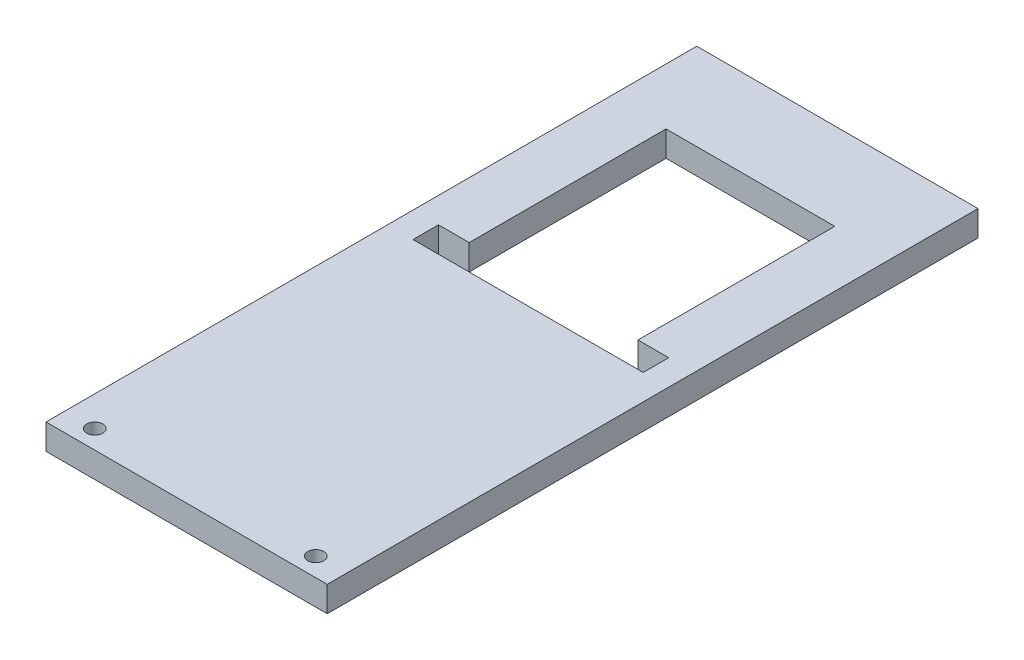
ISO-10303-21;
HEADER;
FILE_DESCRIPTION(('STEP AP214'),'2;1');
FILE_NAME('part.step','',(''),(''),'','','');
FILE_SCHEMA(('AUTOMOTIVE_DESIGN { 1 0 10303 214 1 1 1 1 }'));
ENDSEC;
DATA;
#1=APPLICATION_CONTEXT('core data for automotive mechanical design processes');
#2=APPLICATION_PROTOCOL_DEFINITION('international standard','automotive_design',2000,#1);
#3=PRODUCT_CONTEXT('',#1,'mechanical');
#4=PRODUCT('Part','Part','',(#3));
#5=PRODUCT_RELATED_PRODUCT_CATEGORY('part','',(#4));
#6=PRODUCT_DEFINITION_FORMATION('','',#4);
#7=PRODUCT_DEFINITION_CONTEXT('part definition',#1,'design');
#8=PRODUCT_DEFINITION('design','',#6,#7);
#9=PRODUCT_DEFINITION_SHAPE('','',#8);
#10=(LENGTH_UNIT() NAMED_UNIT(*) SI_UNIT(.MILLI.,.METRE.));
#11=(NAMED_UNIT(*) PLANE_ANGLE_UNIT() SI_UNIT($,.RADIAN.));
#12=(NAMED_UNIT(*) SI_UNIT($,.STERADIAN.) SOLID_ANGLE_UNIT());
#13=UNCERTAINTY_MEASURE_WITH_UNIT(LENGTH_MEASURE(1.E-05),#10,'distance_accuracy_value','');
#14=(GEOMETRIC_REPRESENTATION_CONTEXT(3) GLOBAL_UNCERTAINTY_ASSIGNED_CONTEXT((#13)) GLOBAL_UNIT_ASSIGNED_CONTEXT((#10,
#11,#12)) REPRESENTATION_CONTEXT('',''));
#15=CARTESIAN_POINT('',(0.,0.,0.));
#16=DIRECTION('',(0.,0.,1.));
#17=DIRECTION('',(1.,0.,0.));
#18=AXIS2_PLACEMENT_3D('',#15,#16,#17);
#19=CARTESIAN_POINT('',(0.,3.175,0.));
#20=DIRECTION('',(0.,1.,0.));
#21=DIRECTION('',(0.,0.,1.));
#22=AXIS2_PLACEMENT_3D('',#19,#20,#21);
#23=PLANE('',#22);
#24=CARTESIAN_POINT('',(27.5,3.175,195.35));
#25=DIRECTION('',(0.,1.,0.));
#26=DIRECTION('',(0.,0.,1.));
#27=AXIS2_PLACEMENT_3D('',#24,#25,#26);
#28=CIRCLE('',#27,2.00000000000001);
#29=CARTESIAN_POINT('',(27.5,3.175,197.35));
#30=VERTEX_POINT('',#29);
#31=EDGE_CURVE('E297',#30,#30,#28,.T.);
#32=ORIENTED_EDGE('',*,*,#31,.F.);
#33=EDGE_LOOP('',(#32));
#34=FACE_BOUND('',#33,.T.);
#35=CARTESIAN_POINT('',(-27.5,3.175,195.35));
#36=DIRECTION('',(0.,1.,0.));
#37=DIRECTION('',(0.,0.,1.));
#38=AXIS2_PLACEMENT_3D('',#35,#36,#37);
#39=CIRCLE('',#38,2.00000000000001);
#40=CARTESIAN_POINT('',(-27.5,3.175,197.35));
#41=VERTEX_POINT('',#40);
#42=EDGE_CURVE('E149',#41,#41,#39,.T.);
#43=ORIENTED_EDGE('',*,*,#42,.F.);
#44=EDGE_LOOP('',(#43));
#45=FACE_BOUND('',#44,.T.);
#46=DIRECTION('',(0.,0.,-1.));
#47=VECTOR('',#46,1.);
#48=CARTESIAN_POINT('',(35.,3.175,0.));
#49=LINE('',#48,#47);
#50=CARTESIAN_POINT('',(35.,3.175,200.));
#51=VERTEX_POINT('',#50);
#52=CARTESIAN_POINT('',(35.,3.175,38.));
#53=VERTEX_POINT('',#52);
#54=EDGE_CURVE('E210',#51,#53,#49,.T.);
#55=ORIENTED_EDGE('',*,*,#54,.T.);
#56=DIRECTION('',(-1.,0.,0.));
#57=VECTOR('',#56,1.);
#58=CARTESIAN_POINT('',(0.,3.175,38.));
#59=LINE('',#58,#57);
#60=CARTESIAN_POINT('',(-35.,3.175,38.));
#61=VERTEX_POINT('',#60);
#62=EDGE_CURVE('E183',#53,#61,#59,.T.);
#63=ORIENTED_EDGE('',*,*,#62,.T.);
#64=DIRECTION('',(0.,0.,1.));
#65=VECTOR('',#64,1.);
#66=CARTESIAN_POINT('',(-35.,3.175,0.));
#67=LINE('',#66,#65);
#68=CARTESIAN_POINT('',(-35.,3.175,200.));
#69=VERTEX_POINT('',#68);
#70=EDGE_CURVE('E205',#61,#69,#67,.T.);
#71=ORIENTED_EDGE('',*,*,#70,.T.);
#72=DIRECTION('',(1.,0.,0.));
#73=VECTOR('',#72,1.);
#74=CARTESIAN_POINT('',(0.,3.175,200.));
#75=LINE('',#74,#73);
#76=EDGE_CURVE('E207',#69,#51,#75,.T.);
#77=ORIENTED_EDGE('',*,*,#76,.T.);
#78=EDGE_LOOP('',(#55,#63,#71,#77));
#79=FACE_BOUND('',#78,.T.);
#80=DIRECTION('',(-1.,0.,0.));
#81=VECTOR('',#80,1.);
#82=CARTESIAN_POINT('',(0.,3.175,108.65));
#83=LINE('',#82,#81);
#84=CARTESIAN_POINT('',(-21.,3.175,108.65));
#85=VERTEX_POINT('',#84);
#86=CARTESIAN_POINT('',(-28.65,3.175,108.65));
#87=VERTEX_POINT('',#86);
#88=EDGE_CURVE('E164',#85,#87,#83,.T.);
#89=ORIENTED_EDGE('',*,*,#88,.F.);
#90=DIRECTION('',(0.,0.,-1.));
#91=VECTOR('',#90,1.);
#92=CARTESIAN_POINT('',(-21.,3.175,0.));
#93=LINE('',#92,#91);
#94=CARTESIAN_POINT('',(-21.,3.175,59.65));
#95=VERTEX_POINT('',#94);
#96=EDGE_CURVE('E52',#85,#95,#93,.T.);
#97=ORIENTED_EDGE('',*,*,#96,.T.);
#98=DIRECTION('',(-1.,0.,0.));
#99=VECTOR('',#98,1.);
#100=CARTESIAN_POINT('',(0.,3.175,59.65));
#101=LINE('',#100,#99);
#102=CARTESIAN_POINT('',(21.,3.175,59.65));
#103=VERTEX_POINT('',#102);
#104=EDGE_CURVE('E143',#103,#95,#101,.T.);
#105=ORIENTED_EDGE('',*,*,#104,.F.);
#106=DIRECTION('',(0.,0.,-1.));
#107=VECTOR('',#106,1.);
#108=CARTESIAN_POINT('',(21.,3.175,0.));
#109=LINE('',#108,#107);
#110=CARTESIAN_POINT('',(21.,3.175,108.65));
#111=VERTEX_POINT('',#110);
#112=EDGE_CURVE('E146',#111,#103,#109,.T.);
#113=ORIENTED_EDGE('',*,*,#112,.F.);
#114=DIRECTION('',(1.,0.,0.));
#115=VECTOR('',#114,1.);
#116=CARTESIAN_POINT('',(0.,3.175,108.65));
#117=LINE('',#116,#115);
#118=CARTESIAN_POINT('',(28.65,3.175,108.65));
#119=VERTEX_POINT('',#118);
#120=EDGE_CURVE('E176',#111,#119,#117,.T.);
#121=ORIENTED_EDGE('',*,*,#120,.T.);
#122=DIRECTION('',(0.,0.,-1.));
#123=VECTOR('',#122,1.);
#124=CARTESIAN_POINT('',(28.65,3.175,0.));
#125=LINE('',#124,#123);
#126=CARTESIAN_POINT('',(28.65,3.175,115.));
#127=VERTEX_POINT('',#126);
#128=EDGE_CURVE('E173',#127,#119,#125,.T.);
#129=ORIENTED_EDGE('',*,*,#128,.F.);
#130=DIRECTION('',(-1.,0.,0.));
#131=VECTOR('',#130,1.);
#132=CARTESIAN_POINT('',(0.,3.175,115.));
#133=LINE('',#132,#131);
#134=CARTESIAN_POINT('',(-28.65,3.175,115.));
#135=VERTEX_POINT('',#134);
#136=EDGE_CURVE('E170',#127,#135,#133,.T.);
#137=ORIENTED_EDGE('',*,*,#136,.T.);
#138=DIRECTION('',(0.,0.,-1.));
#139=VECTOR('',#138,1.);
#140=CARTESIAN_POINT('',(-28.6500000000001,3.175,0.));
#141=LINE('',#140,#139);
#142=EDGE_CURVE('E167',#135,#87,#141,.T.);
#143=ORIENTED_EDGE('',*,*,#142,.T.);
#144=EDGE_LOOP('',(#89,#97,#105,#113,#121,#129,#137,#143));
#145=FACE_BOUND('',#144,.T.);
#146=ADVANCED_FACE('F37',(#34,#45,#79,#145),#23,.T.);
#147=CARTESIAN_POINT('',(0.,-3.175,0.));
#148=DIRECTION('',(0.,1.,0.));
#149=DIRECTION('',(0.,0.,1.));
#150=AXIS2_PLACEMENT_3D('',#147,#148,#149);
#151=PLANE('',#150);
#152=CARTESIAN_POINT('',(27.5,-3.175,195.35));
#153=DIRECTION('',(0.,1.,0.));
#154=DIRECTION('',(0.,0.,1.));
#155=AXIS2_PLACEMENT_3D('',#152,#153,#154);
#156=CIRCLE('',#155,2.00000000000001);
#157=CARTESIAN_POINT('',(27.5,-3.175,197.35));
#158=VERTEX_POINT('',#157);
#159=EDGE_CURVE('E165',#158,#158,#156,.T.);
#160=ORIENTED_EDGE('',*,*,#159,.T.);
#161=EDGE_LOOP('',(#160));
#162=FACE_BOUND('',#161,.T.);
#163=CARTESIAN_POINT('',(-27.5,-3.175,195.35));
#164=DIRECTION('',(0.,1.,0.));
#165=DIRECTION('',(0.,0.,1.));
#166=AXIS2_PLACEMENT_3D('',#163,#164,#165);
#167=CIRCLE('',#166,2.00000000000001);
#168=CARTESIAN_POINT('',(-27.5,-3.175,197.35));
#169=VERTEX_POINT('',#168);
#170=EDGE_CURVE('E298',#169,#169,#167,.T.);
#171=ORIENTED_EDGE('',*,*,#170,.T.);
#172=EDGE_LOOP('',(#171));
#173=FACE_BOUND('',#172,.T.);
#174=DIRECTION('',(-1.,0.,0.));
#175=VECTOR('',#174,1.);
#176=CARTESIAN_POINT('',(0.,-3.175,38.));
#177=LINE('',#176,#175);
#178=CARTESIAN_POINT('',(35.,-3.175,38.));
#179=VERTEX_POINT('',#178);
#180=CARTESIAN_POINT('',(-35.,-3.175,38.));
#181=VERTEX_POINT('',#180);
#182=EDGE_CURVE('E195',#179,#181,#177,.T.);
#183=ORIENTED_EDGE('',*,*,#182,.F.);
#184=DIRECTION('',(0.,0.,-1.));
#185=VECTOR('',#184,1.);
#186=CARTESIAN_POINT('',(35.,-3.175,0.));
#187=LINE('',#186,#185);
#188=CARTESIAN_POINT('',(35.,-3.175,200.));
#189=VERTEX_POINT('',#188);
#190=EDGE_CURVE('E208',#189,#179,#187,.T.);
#191=ORIENTED_EDGE('',*,*,#190,.F.);
#192=DIRECTION('',(1.,0.,0.));
#193=VECTOR('',#192,1.);
#194=CARTESIAN_POINT('',(0.,-3.175,200.));
#195=LINE('',#194,#193);
#196=CARTESIAN_POINT('',(-35.,-3.175,200.));
#197=VERTEX_POINT('',#196);
#198=EDGE_CURVE('E214',#197,#189,#195,.T.);
#199=ORIENTED_EDGE('',*,*,#198,.F.);
#200=DIRECTION('',(0.,0.,1.));
#201=VECTOR('',#200,1.);
#202=CARTESIAN_POINT('',(-35.,-3.175,0.));
#203=LINE('',#202,#201);
#204=EDGE_CURVE('E202',#181,#197,#203,.T.);
#205=ORIENTED_EDGE('',*,*,#204,.F.);
#206=EDGE_LOOP('',(#183,#191,#199,#205));
#207=FACE_BOUND('',#206,.T.);
#208=DIRECTION('',(0.,0.,-1.));
#209=VECTOR('',#208,1.);
#210=CARTESIAN_POINT('',(-21.,-3.175,0.));
#211=LINE('',#210,#209);
#212=CARTESIAN_POINT('',(-21.,-3.175,108.65));
#213=VERTEX_POINT('',#212);
#214=CARTESIAN_POINT('',(-21.,-3.175,59.65));
#215=VERTEX_POINT('',#214);
#216=EDGE_CURVE('E127',#213,#215,#211,.T.);
#217=ORIENTED_EDGE('',*,*,#216,.F.);
#218=DIRECTION('',(-1.,0.,0.));
#219=VECTOR('',#218,1.);
#220=CARTESIAN_POINT('',(0.,-3.175,108.65));
#221=LINE('',#220,#219);
#222=CARTESIAN_POINT('',(-28.65,-3.175,108.65));
#223=VERTEX_POINT('',#222);
#224=EDGE_CURVE('E133',#213,#223,#221,.T.);
#225=ORIENTED_EDGE('',*,*,#224,.T.);
#226=DIRECTION('',(0.,0.,-1.));
#227=VECTOR('',#226,1.);
#228=CARTESIAN_POINT('',(-28.6500000000001,-3.175,0.));
#229=LINE('',#228,#227);
#230=CARTESIAN_POINT('',(-28.65,-3.175,115.));
#231=VERTEX_POINT('',#230);
#232=EDGE_CURVE('E137',#231,#223,#229,.T.);
#233=ORIENTED_EDGE('',*,*,#232,.F.);
#234=DIRECTION('',(-1.,0.,0.));
#235=VECTOR('',#234,1.);
#236=CARTESIAN_POINT('',(0.,-3.175,115.));
#237=LINE('',#236,#235);
#238=CARTESIAN_POINT('',(28.65,-3.175,115.));
#239=VERTEX_POINT('',#238);
#240=EDGE_CURVE('E153',#239,#231,#237,.T.);
#241=ORIENTED_EDGE('',*,*,#240,.F.);
#242=DIRECTION('',(0.,0.,-1.));
#243=VECTOR('',#242,1.);
#244=CARTESIAN_POINT('',(28.65,-3.175,0.));
#245=LINE('',#244,#243);
#246=CARTESIAN_POINT('',(28.65,-3.175,108.65));
#247=VERTEX_POINT('',#246);
#248=EDGE_CURVE('E155',#239,#247,#245,.T.);
#249=ORIENTED_EDGE('',*,*,#248,.T.);
#250=DIRECTION('',(1.,0.,0.));
#251=VECTOR('',#250,1.);
#252=CARTESIAN_POINT('',(0.,-3.175,108.65));
#253=LINE('',#252,#251);
#254=CARTESIAN_POINT('',(21.,-3.175,108.65));
#255=VERTEX_POINT('',#254);
#256=EDGE_CURVE('E158',#255,#247,#253,.T.);
#257=ORIENTED_EDGE('',*,*,#256,.F.);
#258=DIRECTION('',(0.,0.,-1.));
#259=VECTOR('',#258,1.);
#260=CARTESIAN_POINT('',(21.,-3.175,0.));
#261=LINE('',#260,#259);
#262=CARTESIAN_POINT('',(21.,-3.175,59.65));
#263=VERTEX_POINT('',#262);
#264=EDGE_CURVE('E160',#255,#263,#261,.T.);
#265=ORIENTED_EDGE('',*,*,#264,.T.);
#266=DIRECTION('',(-1.,0.,0.));
#267=VECTOR('',#266,1.);
#268=CARTESIAN_POINT('',(0.,-3.175,59.65));
#269=LINE('',#268,#267);
#270=EDGE_CURVE('E130',#263,#215,#269,.T.);
#271=ORIENTED_EDGE('',*,*,#270,.T.);
#272=EDGE_LOOP('',(#217,#225,#233,#241,#249,#257,#265,#271));
#273=FACE_BOUND('',#272,.T.);
#274=ADVANCED_FACE('F140',(#162,#173,#207,#273),#151,.F.);
#275=CARTESIAN_POINT('',(-35.,3.175,0.));
#276=DIRECTION('',(1.,0.,0.));
#277=DIRECTION('',(0.,0.,-1.));
#278=AXIS2_PLACEMENT_3D('',#275,#276,#277);
#279=PLANE('',#278);
#280=DIRECTION('',(0.,1.,0.));
#281=VECTOR('',#280,1.);
#282=CARTESIAN_POINT('',(-35.,-3.175,38.));
#283=LINE('',#282,#281);
#284=EDGE_CURVE('E200',#181,#61,#283,.T.);
#285=ORIENTED_EDGE('',*,*,#284,.F.);
#286=ORIENTED_EDGE('',*,*,#204,.T.);
#287=DIRECTION('',(0.,-1.,0.));
#288=VECTOR('',#287,1.);
#289=CARTESIAN_POINT('',(-35.,3.175,200.));
#290=LINE('',#289,#288);
#291=EDGE_CURVE('E11',#69,#197,#290,.T.);
#292=ORIENTED_EDGE('',*,*,#291,.F.);
#293=ORIENTED_EDGE('',*,*,#70,.F.);
#294=EDGE_LOOP('',(#285,#286,#292,#293));
#295=FACE_BOUND('',#294,.T.);
#296=ADVANCED_FACE('F39',(#295),#279,.F.);
#297=CARTESIAN_POINT('',(35.,3.175,0.));
#298=DIRECTION('',(-1.,0.,0.));
#299=DIRECTION('',(0.,0.,1.));
#300=AXIS2_PLACEMENT_3D('',#297,#298,#299);
#301=PLANE('',#300);
#302=DIRECTION('',(0.,1.,0.));
#303=VECTOR('',#302,1.);
#304=CARTESIAN_POINT('',(35.,-3.175,38.));
#305=LINE('',#304,#303);
#306=EDGE_CURVE('E197',#179,#53,#305,.T.);
#307=ORIENTED_EDGE('',*,*,#306,.T.);
#308=ORIENTED_EDGE('',*,*,#54,.F.);
#309=DIRECTION('',(0.,-1.,0.));
#310=VECTOR('',#309,1.);
#311=CARTESIAN_POINT('',(35.,3.175,200.));
#312=LINE('',#311,#310);
#313=EDGE_CURVE('E45',#51,#189,#312,.T.);
#314=ORIENTED_EDGE('',*,*,#313,.T.);
#315=ORIENTED_EDGE('',*,*,#190,.T.);
#316=EDGE_LOOP('',(#307,#308,#314,#315));
#317=FACE_BOUND('',#316,.T.);
#318=ADVANCED_FACE('F222',(#317),#301,.F.);
#319=CARTESIAN_POINT('',(0.,3.175,200.));
#320=DIRECTION('',(0.,0.,-1.));
#321=DIRECTION('',(-1.,0.,0.));
#322=AXIS2_PLACEMENT_3D('',#319,#320,#321);
#323=PLANE('',#322);
#324=ORIENTED_EDGE('',*,*,#198,.T.);
#325=ORIENTED_EDGE('',*,*,#313,.F.);
#326=ORIENTED_EDGE('',*,*,#76,.F.);
#327=ORIENTED_EDGE('',*,*,#291,.T.);
#328=EDGE_LOOP('',(#324,#325,#326,#327));
#329=FACE_BOUND('',#328,.T.);
#330=ADVANCED_FACE('F237',(#329),#323,.F.);
#331=CARTESIAN_POINT('',(0.,-3.175,38.));
#332=DIRECTION('',(0.,0.,-1.));
#333=DIRECTION('',(-1.,0.,0.));
#334=AXIS2_PLACEMENT_3D('',#331,#332,#333);
#335=PLANE('',#334);
#336=ORIENTED_EDGE('',*,*,#62,.F.);
#337=ORIENTED_EDGE('',*,*,#306,.F.);
#338=ORIENTED_EDGE('',*,*,#182,.T.);
#339=ORIENTED_EDGE('',*,*,#284,.T.);
#340=EDGE_LOOP('',(#336,#337,#338,#339));
#341=FACE_BOUND('',#340,.T.);
#342=ADVANCED_FACE('F231',(#341),#335,.T.);
#343=CARTESIAN_POINT('',(-21.,-3.175,0.));
#344=DIRECTION('',(1.,0.,0.));
#345=DIRECTION('',(0.,0.,-1.));
#346=AXIS2_PLACEMENT_3D('',#343,#344,#345);
#347=PLANE('',#346);
#348=ORIENTED_EDGE('',*,*,#96,.F.);
#349=DIRECTION('',(0.,1.,0.));
#350=VECTOR('',#349,1.);
#351=CARTESIAN_POINT('',(-21.,-3.175,108.65));
#352=LINE('',#351,#350);
#353=EDGE_CURVE('E124',#213,#85,#352,.T.);
#354=ORIENTED_EDGE('',*,*,#353,.F.);
#355=ORIENTED_EDGE('',*,*,#216,.T.);
#356=DIRECTION('',(0.,1.,0.));
#357=VECTOR('',#356,1.);
#358=CARTESIAN_POINT('',(-21.,-3.175,59.65));
#359=LINE('',#358,#357);
#360=EDGE_CURVE('E181',#215,#95,#359,.T.);
#361=ORIENTED_EDGE('',*,*,#360,.T.);
#362=EDGE_LOOP('',(#348,#354,#355,#361));
#363=FACE_BOUND('',#362,.T.);
#364=ADVANCED_FACE('F125',(#363),#347,.T.);
#365=CARTESIAN_POINT('',(0.,-3.175,59.65));
#366=DIRECTION('',(0.,0.,-1.));
#367=DIRECTION('',(-1.,0.,0.));
#368=AXIS2_PLACEMENT_3D('',#365,#366,#367);
#369=PLANE('',#368);
#370=ORIENTED_EDGE('',*,*,#104,.T.);
#371=ORIENTED_EDGE('',*,*,#360,.F.);
#372=ORIENTED_EDGE('',*,*,#270,.F.);
#373=DIRECTION('',(0.,1.,0.));
#374=VECTOR('',#373,1.);
#375=CARTESIAN_POINT('',(21.,-3.175,59.65));
#376=LINE('',#375,#374);
#377=EDGE_CURVE('E184',#263,#103,#376,.T.);
#378=ORIENTED_EDGE('',*,*,#377,.T.);
#379=EDGE_LOOP('',(#370,#371,#372,#378));
#380=FACE_BOUND('',#379,.T.);
#381=ADVANCED_FACE('F258',(#380),#369,.F.);
#382=CARTESIAN_POINT('',(21.,-3.175,0.));
#383=DIRECTION('',(1.,0.,0.));
#384=DIRECTION('',(0.,0.,-1.));
#385=AXIS2_PLACEMENT_3D('',#382,#383,#384);
#386=PLANE('',#385);
#387=ORIENTED_EDGE('',*,*,#112,.T.);
#388=ORIENTED_EDGE('',*,*,#377,.F.);
#389=ORIENTED_EDGE('',*,*,#264,.F.);
#390=DIRECTION('',(0.,1.,0.));
#391=VECTOR('',#390,1.);
#392=CARTESIAN_POINT('',(21.,-3.175,108.65));
#393=LINE('',#392,#391);
#394=EDGE_CURVE('E186',#255,#111,#393,.T.);
#395=ORIENTED_EDGE('',*,*,#394,.T.);
#396=EDGE_LOOP('',(#387,#388,#389,#395));
#397=FACE_BOUND('',#396,.T.);
#398=ADVANCED_FACE('F277',(#397),#386,.F.);
#399=CARTESIAN_POINT('',(0.,-3.175,108.65));
#400=DIRECTION('',(0.,0.,1.));
#401=DIRECTION('',(1.,0.,0.));
#402=AXIS2_PLACEMENT_3D('',#399,#400,#401);
#403=PLANE('',#402);
#404=ORIENTED_EDGE('',*,*,#120,.F.);
#405=ORIENTED_EDGE('',*,*,#394,.F.);
#406=ORIENTED_EDGE('',*,*,#256,.T.);
#407=DIRECTION('',(0.,1.,0.));
#408=VECTOR('',#407,1.);
#409=CARTESIAN_POINT('',(28.65,-3.175,108.65));
#410=LINE('',#409,#408);
#411=EDGE_CURVE('E188',#247,#119,#410,.T.);
#412=ORIENTED_EDGE('',*,*,#411,.T.);
#413=EDGE_LOOP('',(#404,#405,#406,#412));
#414=FACE_BOUND('',#413,.T.);
#415=ADVANCED_FACE('F273',(#414),#403,.T.);
#416=CARTESIAN_POINT('',(28.65,-3.175,0.));
#417=DIRECTION('',(1.,0.,0.));
#418=DIRECTION('',(0.,0.,-1.));
#419=AXIS2_PLACEMENT_3D('',#416,#417,#418);
#420=PLANE('',#419);
#421=ORIENTED_EDGE('',*,*,#128,.T.);
#422=ORIENTED_EDGE('',*,*,#411,.F.);
#423=ORIENTED_EDGE('',*,*,#248,.F.);
#424=DIRECTION('',(0.,1.,0.));
#425=VECTOR('',#424,1.);
#426=CARTESIAN_POINT('',(28.65,-3.175,115.));
#427=LINE('',#426,#425);
#428=EDGE_CURVE('E190',#239,#127,#427,.T.);
#429=ORIENTED_EDGE('',*,*,#428,.T.);
#430=EDGE_LOOP('',(#421,#422,#423,#429));
#431=FACE_BOUND('',#430,.T.);
#432=ADVANCED_FACE('F269',(#431),#420,.F.);
#433=CARTESIAN_POINT('',(0.,-3.175,115.));
#434=DIRECTION('',(0.,0.,-1.));
#435=DIRECTION('',(-1.,0.,0.));
#436=AXIS2_PLACEMENT_3D('',#433,#434,#435);
#437=PLANE('',#436);
#438=ORIENTED_EDGE('',*,*,#136,.F.);
#439=ORIENTED_EDGE('',*,*,#428,.F.);
#440=ORIENTED_EDGE('',*,*,#240,.T.);
#441=DIRECTION('',(0.,1.,0.));
#442=VECTOR('',#441,1.);
#443=CARTESIAN_POINT('',(-28.65,-3.175,115.));
#444=LINE('',#443,#442);
#445=EDGE_CURVE('E192',#231,#135,#444,.T.);
#446=ORIENTED_EDGE('',*,*,#445,.T.);
#447=EDGE_LOOP('',(#438,#439,#440,#446));
#448=FACE_BOUND('',#447,.T.);
#449=ADVANCED_FACE('F265',(#448),#437,.T.);
#450=CARTESIAN_POINT('',(-28.6500000000001,-3.175,0.));
#451=DIRECTION('',(1.,0.,0.));
#452=DIRECTION('',(0.,0.,-1.));
#453=AXIS2_PLACEMENT_3D('',#450,#451,#452);
#454=PLANE('',#453);
#455=ORIENTED_EDGE('',*,*,#142,.F.);
#456=ORIENTED_EDGE('',*,*,#445,.F.);
#457=ORIENTED_EDGE('',*,*,#232,.T.);
#458=DIRECTION('',(0.,1.,0.));
#459=VECTOR('',#458,1.);
#460=CARTESIAN_POINT('',(-28.65,-3.175,108.65));
#461=LINE('',#460,#459);
#462=EDGE_CURVE('E60',#223,#87,#461,.T.);
#463=ORIENTED_EDGE('',*,*,#462,.T.);
#464=EDGE_LOOP('',(#455,#456,#457,#463));
#465=FACE_BOUND('',#464,.T.);
#466=ADVANCED_FACE('F262',(#465),#454,.T.);
#467=CARTESIAN_POINT('',(0.,-3.175,108.65));
#468=DIRECTION('',(0.,0.,-1.));
#469=DIRECTION('',(-1.,0.,0.));
#470=AXIS2_PLACEMENT_3D('',#467,#468,#469);
#471=PLANE('',#470);
#472=ORIENTED_EDGE('',*,*,#88,.T.);
#473=ORIENTED_EDGE('',*,*,#462,.F.);
#474=ORIENTED_EDGE('',*,*,#224,.F.);
#475=ORIENTED_EDGE('',*,*,#353,.T.);
#476=EDGE_LOOP('',(#472,#473,#474,#475));
#477=FACE_BOUND('',#476,.T.);
#478=ADVANCED_FACE('F134',(#477),#471,.F.);
#479=CARTESIAN_POINT('',(-27.5,-3.175,195.35));
#480=DIRECTION('',(0.,1.,0.));
#481=DIRECTION('',(0.,0.,1.));
#482=AXIS2_PLACEMENT_3D('',#479,#480,#481);
#483=CYLINDRICAL_SURFACE('',#482,2.00000000000001);
#484=ORIENTED_EDGE('',*,*,#170,.F.);
#485=EDGE_LOOP('',(#484));
#486=FACE_BOUND('',#485,.T.);
#487=ORIENTED_EDGE('',*,*,#42,.T.);
#488=EDGE_LOOP('',(#487));
#489=FACE_BOUND('',#488,.T.);
#490=ADVANCED_FACE('F261',(#486,#489),#483,.F.);
#491=CARTESIAN_POINT('',(27.5,-3.175,195.35));
#492=DIRECTION('',(0.,1.,0.));
#493=DIRECTION('',(0.,0.,1.));
#494=AXIS2_PLACEMENT_3D('',#491,#492,#493);
#495=CYLINDRICAL_SURFACE('',#494,2.00000000000001);
#496=ORIENTED_EDGE('',*,*,#159,.F.);
#497=EDGE_LOOP('',(#496));
#498=FACE_BOUND('',#497,.T.);
#499=ORIENTED_EDGE('',*,*,#31,.T.);
#500=EDGE_LOOP('',(#499));
#501=FACE_BOUND('',#500,.T.);
#502=ADVANCED_FACE('F287',(#498,#501),#495,.F.);
#503=CLOSED_SHELL('',(#146,#274,#296,#318,#330,#342,#364,#381,#398,#415,#432,#449,#466,#478,
#490,#502));
#504=MANIFOLD_SOLID_BREP('B2',#503);
#505=ADVANCED_BREP_SHAPE_REPRESENTATION('',(#18,#504),#14);
#506=SHAPE_DEFINITION_REPRESENTATION(#9,#505);
ENDSEC;
END-ISO-10303-21;
